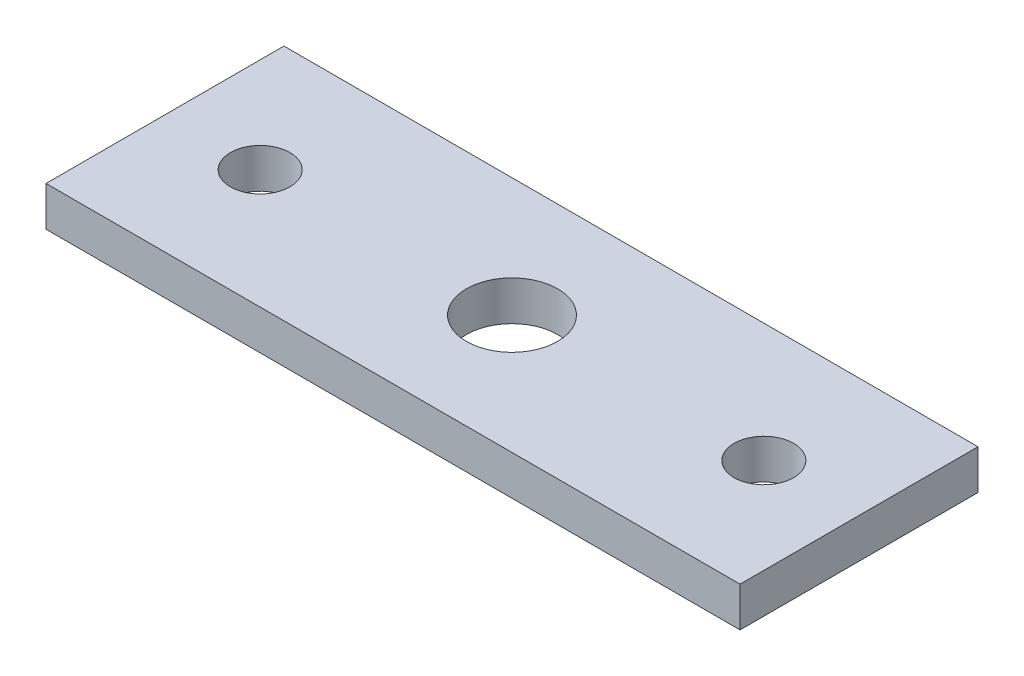
ISO-10303-21;
HEADER;
FILE_DESCRIPTION(('STEP AP214'),'2;1');
FILE_NAME('part.step','',(''),(''),'','','');
FILE_SCHEMA(('AUTOMOTIVE_DESIGN { 1 0 10303 214 1 1 1 1 }'));
ENDSEC;
DATA;
#1=APPLICATION_CONTEXT('core data for automotive mechanical design processes');
#2=APPLICATION_PROTOCOL_DEFINITION('international standard','automotive_design',2000,#1);
#3=PRODUCT_CONTEXT('',#1,'mechanical');
#4=PRODUCT('Part','Part','',(#3));
#5=PRODUCT_RELATED_PRODUCT_CATEGORY('part','',(#4));
#6=PRODUCT_DEFINITION_FORMATION('','',#4);
#7=PRODUCT_DEFINITION_CONTEXT('part definition',#1,'design');
#8=PRODUCT_DEFINITION('design','',#6,#7);
#9=PRODUCT_DEFINITION_SHAPE('','',#8);
#10=(LENGTH_UNIT() NAMED_UNIT(*) SI_UNIT(.MILLI.,.METRE.));
#11=(NAMED_UNIT(*) PLANE_ANGLE_UNIT() SI_UNIT($,.RADIAN.));
#12=(NAMED_UNIT(*) SI_UNIT($,.STERADIAN.) SOLID_ANGLE_UNIT());
#13=UNCERTAINTY_MEASURE_WITH_UNIT(LENGTH_MEASURE(1.E-05),#10,'distance_accuracy_value','');
#14=(GEOMETRIC_REPRESENTATION_CONTEXT(3) GLOBAL_UNCERTAINTY_ASSIGNED_CONTEXT((#13)) GLOBAL_UNIT_ASSIGNED_CONTEXT((#10,
#11,#12)) REPRESENTATION_CONTEXT('',''));
#15=CARTESIAN_POINT('',(0.,0.,0.));
#16=DIRECTION('',(0.,0.,1.));
#17=DIRECTION('',(1.,0.,0.));
#18=AXIS2_PLACEMENT_3D('',#15,#16,#17);
#19=CARTESIAN_POINT('',(0.,2.,0.));
#20=DIRECTION('',(0.,1.,0.));
#21=DIRECTION('',(0.,0.,1.));
#22=AXIS2_PLACEMENT_3D('',#19,#20,#21);
#23=PLANE('',#22);
#24=CARTESIAN_POINT('',(12.7,2.,0.));
#25=DIRECTION('',(0.,1.,0.));
#26=DIRECTION('',(0.,0.,1.));
#27=AXIS2_PLACEMENT_3D('',#24,#25,#26);
#28=CIRCLE('',#27,1.5);
#29=CARTESIAN_POINT('',(12.7,2.,1.5));
#30=VERTEX_POINT('',#29);
#31=EDGE_CURVE('E119',#30,#30,#28,.T.);
#32=ORIENTED_EDGE('',*,*,#31,.F.);
#33=EDGE_LOOP('',(#32));
#34=FACE_BOUND('',#33,.T.);
#35=DIRECTION('',(0.,0.,1.));
#36=VECTOR('',#35,1.);
#37=CARTESIAN_POINT('',(-17.5,2.,6.00000000000001));
#38=LINE('',#37,#36);
#39=CARTESIAN_POINT('',(-17.5,2.,-5.99999999999999));
#40=VERTEX_POINT('',#39);
#41=CARTESIAN_POINT('',(-17.5,2.,6.00000000000001));
#42=VERTEX_POINT('',#41);
#43=EDGE_CURVE('E89',#40,#42,#38,.T.);
#44=ORIENTED_EDGE('',*,*,#43,.T.);
#45=DIRECTION('',(1.,0.,0.));
#46=VECTOR('',#45,1.);
#47=CARTESIAN_POINT('',(17.5,2.,6.));
#48=LINE('',#47,#46);
#49=CARTESIAN_POINT('',(17.5,2.,6.));
#50=VERTEX_POINT('',#49);
#51=EDGE_CURVE('E84',#42,#50,#48,.T.);
#52=ORIENTED_EDGE('',*,*,#51,.T.);
#53=DIRECTION('',(0.,0.,-1.));
#54=VECTOR('',#53,1.);
#55=CARTESIAN_POINT('',(17.5,2.,6.));
#56=LINE('',#55,#54);
#57=CARTESIAN_POINT('',(17.5,2.,-6.));
#58=VERTEX_POINT('',#57);
#59=EDGE_CURVE('E87',#50,#58,#56,.T.);
#60=ORIENTED_EDGE('',*,*,#59,.T.);
#61=DIRECTION('',(-1.,0.,0.));
#62=VECTOR('',#61,1.);
#63=CARTESIAN_POINT('',(17.5,2.,-6.));
#64=LINE('',#63,#62);
#65=EDGE_CURVE('E54',#58,#40,#64,.T.);
#66=ORIENTED_EDGE('',*,*,#65,.T.);
#67=EDGE_LOOP('',(#44,#52,#60,#66));
#68=FACE_BOUND('',#67,.T.);
#69=CARTESIAN_POINT('',(0.,2.,0.));
#70=DIRECTION('',(0.,1.,0.));
#71=DIRECTION('',(0.,0.,1.));
#72=AXIS2_PLACEMENT_3D('',#69,#70,#71);
#73=CIRCLE('',#72,2.3);
#74=CARTESIAN_POINT('',(0.,2.,2.30000000000001));
#75=VERTEX_POINT('',#74);
#76=EDGE_CURVE('E104',#75,#75,#73,.T.);
#77=ORIENTED_EDGE('',*,*,#76,.F.);
#78=EDGE_LOOP('',(#77));
#79=FACE_BOUND('',#78,.T.);
#80=CARTESIAN_POINT('',(-12.7,2.,0.));
#81=DIRECTION('',(0.,1.,0.));
#82=DIRECTION('',(0.,0.,-1.));
#83=AXIS2_PLACEMENT_3D('',#80,#81,#82);
#84=CIRCLE('',#83,1.5);
#85=CARTESIAN_POINT('',(-12.7,2.,-1.5));
#86=VERTEX_POINT('',#85);
#87=EDGE_CURVE('E125',#86,#86,#84,.T.);
#88=ORIENTED_EDGE('',*,*,#87,.F.);
#89=EDGE_LOOP('',(#88));
#90=FACE_BOUND('',#89,.T.);
#91=ADVANCED_FACE('F37',(#34,#68,#79,#90),#23,.T.);
#92=CARTESIAN_POINT('',(0.,0.,0.));
#93=DIRECTION('',(0.,1.,0.));
#94=DIRECTION('',(0.,0.,1.));
#95=AXIS2_PLACEMENT_3D('',#92,#93,#94);
#96=PLANE('',#95);
#97=DIRECTION('',(0.,0.,1.));
#98=VECTOR('',#97,1.);
#99=CARTESIAN_POINT('',(-17.5,0.,6.00000000000001));
#100=LINE('',#99,#98);
#101=CARTESIAN_POINT('',(-17.5,0.,-5.99999999999999));
#102=VERTEX_POINT('',#101);
#103=CARTESIAN_POINT('',(-17.5,0.,6.00000000000001));
#104=VERTEX_POINT('',#103);
#105=EDGE_CURVE('E101',#102,#104,#100,.T.);
#106=ORIENTED_EDGE('',*,*,#105,.F.);
#107=DIRECTION('',(-1.,0.,0.));
#108=VECTOR('',#107,1.);
#109=CARTESIAN_POINT('',(17.5,0.,-6.));
#110=LINE('',#109,#108);
#111=CARTESIAN_POINT('',(17.5,0.,-6.));
#112=VERTEX_POINT('',#111);
#113=EDGE_CURVE('E77',#112,#102,#110,.T.);
#114=ORIENTED_EDGE('',*,*,#113,.F.);
#115=DIRECTION('',(0.,0.,-1.));
#116=VECTOR('',#115,1.);
#117=CARTESIAN_POINT('',(17.5,0.,6.));
#118=LINE('',#117,#116);
#119=CARTESIAN_POINT('',(17.5,0.,6.));
#120=VERTEX_POINT('',#119);
#121=EDGE_CURVE('E71',#120,#112,#118,.T.);
#122=ORIENTED_EDGE('',*,*,#121,.F.);
#123=DIRECTION('',(1.,0.,0.));
#124=VECTOR('',#123,1.);
#125=CARTESIAN_POINT('',(17.5,0.,6.));
#126=LINE('',#125,#124);
#127=EDGE_CURVE('E93',#104,#120,#126,.T.);
#128=ORIENTED_EDGE('',*,*,#127,.F.);
#129=EDGE_LOOP('',(#106,#114,#122,#128));
#130=FACE_BOUND('',#129,.T.);
#131=CARTESIAN_POINT('',(0.,0.,0.));
#132=DIRECTION('',(0.,1.,0.));
#133=DIRECTION('',(0.,0.,1.));
#134=AXIS2_PLACEMENT_3D('',#131,#132,#133);
#135=CIRCLE('',#134,2.3);
#136=CARTESIAN_POINT('',(0.,0.,2.30000000000001));
#137=VERTEX_POINT('',#136);
#138=EDGE_CURVE('E116',#137,#137,#135,.T.);
#139=ORIENTED_EDGE('',*,*,#138,.T.);
#140=EDGE_LOOP('',(#139));
#141=FACE_BOUND('',#140,.T.);
#142=CARTESIAN_POINT('',(12.7,0.,0.));
#143=DIRECTION('',(0.,1.,0.));
#144=DIRECTION('',(0.,0.,1.));
#145=AXIS2_PLACEMENT_3D('',#142,#143,#144);
#146=CIRCLE('',#145,1.5);
#147=CARTESIAN_POINT('',(12.7,0.,1.5));
#148=VERTEX_POINT('',#147);
#149=EDGE_CURVE('E122',#148,#148,#146,.T.);
#150=ORIENTED_EDGE('',*,*,#149,.T.);
#151=EDGE_LOOP('',(#150));
#152=FACE_BOUND('',#151,.T.);
#153=CARTESIAN_POINT('',(-12.7,0.,0.));
#154=DIRECTION('',(0.,1.,0.));
#155=DIRECTION('',(0.,0.,-1.));
#156=AXIS2_PLACEMENT_3D('',#153,#154,#155);
#157=CIRCLE('',#156,1.5);
#158=CARTESIAN_POINT('',(-12.7,0.,-1.5));
#159=VERTEX_POINT('',#158);
#160=EDGE_CURVE('E128',#159,#159,#157,.T.);
#161=ORIENTED_EDGE('',*,*,#160,.T.);
#162=EDGE_LOOP('',(#161));
#163=FACE_BOUND('',#162,.T.);
#164=ADVANCED_FACE('F112',(#130,#141,#152,#163),#96,.F.);
#165=CARTESIAN_POINT('',(-17.5,2.,6.00000000000001));
#166=DIRECTION('',(1.,0.,0.));
#167=DIRECTION('',(0.,0.,-1.));
#168=AXIS2_PLACEMENT_3D('',#165,#166,#167);
#169=PLANE('',#168);
#170=ORIENTED_EDGE('',*,*,#105,.T.);
#171=DIRECTION('',(0.,-1.,0.));
#172=VECTOR('',#171,1.);
#173=CARTESIAN_POINT('',(-17.5,2.,6.00000000000001));
#174=LINE('',#173,#172);
#175=EDGE_CURVE('E11',#42,#104,#174,.T.);
#176=ORIENTED_EDGE('',*,*,#175,.F.);
#177=ORIENTED_EDGE('',*,*,#43,.F.);
#178=DIRECTION('',(0.,-1.,0.));
#179=VECTOR('',#178,1.);
#180=CARTESIAN_POINT('',(-17.5,2.,-5.99999999999999));
#181=LINE('',#180,#179);
#182=EDGE_CURVE('E97',#40,#102,#181,.T.);
#183=ORIENTED_EDGE('',*,*,#182,.T.);
#184=EDGE_LOOP('',(#170,#176,#177,#183));
#185=FACE_BOUND('',#184,.T.);
#186=ADVANCED_FACE('F39',(#185),#169,.F.);
#187=CARTESIAN_POINT('',(17.5,2.,6.));
#188=DIRECTION('',(0.,0.,-1.));
#189=DIRECTION('',(-1.,0.,0.));
#190=AXIS2_PLACEMENT_3D('',#187,#188,#189);
#191=PLANE('',#190);
#192=ORIENTED_EDGE('',*,*,#127,.T.);
#193=DIRECTION('',(0.,-1.,0.));
#194=VECTOR('',#193,1.);
#195=CARTESIAN_POINT('',(17.5,2.,6.));
#196=LINE('',#195,#194);
#197=EDGE_CURVE('E46',#50,#120,#196,.T.);
#198=ORIENTED_EDGE('',*,*,#197,.F.);
#199=ORIENTED_EDGE('',*,*,#51,.F.);
#200=ORIENTED_EDGE('',*,*,#175,.T.);
#201=EDGE_LOOP('',(#192,#198,#199,#200));
#202=FACE_BOUND('',#201,.T.);
#203=ADVANCED_FACE('F92',(#202),#191,.F.);
#204=CARTESIAN_POINT('',(17.5,2.,6.));
#205=DIRECTION('',(-1.,0.,0.));
#206=DIRECTION('',(0.,0.,1.));
#207=AXIS2_PLACEMENT_3D('',#204,#205,#206);
#208=PLANE('',#207);
#209=ORIENTED_EDGE('',*,*,#121,.T.);
#210=DIRECTION('',(0.,-1.,0.));
#211=VECTOR('',#210,1.);
#212=CARTESIAN_POINT('',(17.5,2.,-6.));
#213=LINE('',#212,#211);
#214=EDGE_CURVE('E94',#58,#112,#213,.T.);
#215=ORIENTED_EDGE('',*,*,#214,.F.);
#216=ORIENTED_EDGE('',*,*,#59,.F.);
#217=ORIENTED_EDGE('',*,*,#197,.T.);
#218=EDGE_LOOP('',(#209,#215,#216,#217));
#219=FACE_BOUND('',#218,.T.);
#220=ADVANCED_FACE('F95',(#219),#208,.F.);
#221=CARTESIAN_POINT('',(17.5,2.,-6.));
#222=DIRECTION('',(0.,0.,1.));
#223=DIRECTION('',(1.,0.,0.));
#224=AXIS2_PLACEMENT_3D('',#221,#222,#223);
#225=PLANE('',#224);
#226=ORIENTED_EDGE('',*,*,#113,.T.);
#227=ORIENTED_EDGE('',*,*,#182,.F.);
#228=ORIENTED_EDGE('',*,*,#65,.F.);
#229=ORIENTED_EDGE('',*,*,#214,.T.);
#230=EDGE_LOOP('',(#226,#227,#228,#229));
#231=FACE_BOUND('',#230,.T.);
#232=ADVANCED_FACE('F109',(#231),#225,.F.);
#233=CARTESIAN_POINT('',(0.,2.,0.));
#234=DIRECTION('',(0.,-1.,0.));
#235=DIRECTION('',(0.,0.,-1.));
#236=AXIS2_PLACEMENT_3D('',#233,#234,#235);
#237=CYLINDRICAL_SURFACE('',#236,2.3);
#238=ORIENTED_EDGE('',*,*,#76,.T.);
#239=EDGE_LOOP('',(#238));
#240=FACE_BOUND('',#239,.T.);
#241=ORIENTED_EDGE('',*,*,#138,.F.);
#242=EDGE_LOOP('',(#241));
#243=FACE_BOUND('',#242,.T.);
#244=ADVANCED_FACE('F146',(#240,#243),#237,.F.);
#245=CARTESIAN_POINT('',(12.7,2.,0.));
#246=DIRECTION('',(0.,-1.,0.));
#247=DIRECTION('',(0.,0.,-1.));
#248=AXIS2_PLACEMENT_3D('',#245,#246,#247);
#249=CYLINDRICAL_SURFACE('',#248,1.5);
#250=ORIENTED_EDGE('',*,*,#31,.T.);
#251=EDGE_LOOP('',(#250));
#252=FACE_BOUND('',#251,.T.);
#253=ORIENTED_EDGE('',*,*,#149,.F.);
#254=EDGE_LOOP('',(#253));
#255=FACE_BOUND('',#254,.T.);
#256=ADVANCED_FACE('F192',(#252,#255),#249,.F.);
#257=CARTESIAN_POINT('',(-12.7,2.,0.));
#258=DIRECTION('',(0.,-1.,0.));
#259=DIRECTION('',(0.,0.,-1.));
#260=AXIS2_PLACEMENT_3D('',#257,#258,#259);
#261=CYLINDRICAL_SURFACE('',#260,1.5);
#262=ORIENTED_EDGE('',*,*,#87,.T.);
#263=EDGE_LOOP('',(#262));
#264=FACE_BOUND('',#263,.T.);
#265=ORIENTED_EDGE('',*,*,#160,.F.);
#266=EDGE_LOOP('',(#265));
#267=FACE_BOUND('',#266,.T.);
#268=ADVANCED_FACE('F134',(#264,#267),#261,.F.);
#269=CLOSED_SHELL('',(#91,#164,#186,#203,#220,#232,#244,#256,#268));
#270=MANIFOLD_SOLID_BREP('B2',#269);
#271=ADVANCED_BREP_SHAPE_REPRESENTATION('',(#18,#270),#14);
#272=SHAPE_DEFINITION_REPRESENTATION(#9,#271);
ENDSEC;
END-ISO-10303-21;
